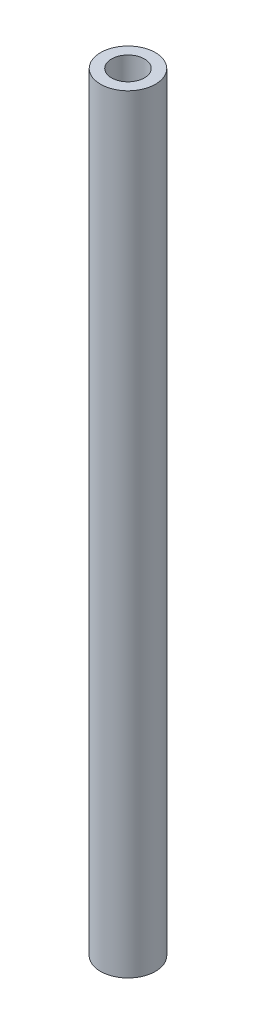
ISO-10303-21;
HEADER;
FILE_DESCRIPTION(('STEP AP214'),'2;1');
FILE_NAME('part.step','',(''),(''),'','','');
FILE_SCHEMA(('AUTOMOTIVE_DESIGN { 1 0 10303 214 1 1 1 1 }'));
ENDSEC;
DATA;
#1=APPLICATION_CONTEXT('core data for automotive mechanical design processes');
#2=APPLICATION_PROTOCOL_DEFINITION('international standard','automotive_design',2000,#1);
#3=PRODUCT_CONTEXT('',#1,'mechanical');
#4=PRODUCT('Part','Part','',(#3));
#5=PRODUCT_RELATED_PRODUCT_CATEGORY('part','',(#4));
#6=PRODUCT_DEFINITION_FORMATION('','',#4);
#7=PRODUCT_DEFINITION_CONTEXT('part definition',#1,'design');
#8=PRODUCT_DEFINITION('design','',#6,#7);
#9=PRODUCT_DEFINITION_SHAPE('','',#8);
#10=(LENGTH_UNIT() NAMED_UNIT(*) SI_UNIT(.MILLI.,.METRE.));
#11=(NAMED_UNIT(*) PLANE_ANGLE_UNIT() SI_UNIT($,.RADIAN.));
#12=(NAMED_UNIT(*) SI_UNIT($,.STERADIAN.) SOLID_ANGLE_UNIT());
#13=UNCERTAINTY_MEASURE_WITH_UNIT(LENGTH_MEASURE(1.E-05),#10,'distance_accuracy_value','');
#14=(GEOMETRIC_REPRESENTATION_CONTEXT(3) GLOBAL_UNCERTAINTY_ASSIGNED_CONTEXT((#13)) GLOBAL_UNIT_ASSIGNED_CONTEXT((#10,
#11,#12)) REPRESENTATION_CONTEXT('',''));
#15=CARTESIAN_POINT('',(0.,0.,0.));
#16=DIRECTION('',(0.,0.,1.));
#17=DIRECTION('',(1.,0.,0.));
#18=AXIS2_PLACEMENT_3D('',#15,#16,#17);
#19=CARTESIAN_POINT('',(0.,70.,0.));
#20=DIRECTION('',(0.,1.,0.));
#21=DIRECTION('',(0.,0.,1.));
#22=AXIS2_PLACEMENT_3D('',#19,#20,#21);
#23=PLANE('',#22);
#24=CARTESIAN_POINT('',(0.,70.,0.));
#25=DIRECTION('',(0.,1.,0.));
#26=DIRECTION('',(0.,0.,1.));
#27=AXIS2_PLACEMENT_3D('',#24,#25,#26);
#28=CIRCLE('',#27,2.5);
#29=CARTESIAN_POINT('',(0.,70.,2.5));
#30=VERTEX_POINT('',#29);
#31=EDGE_CURVE('E10',#30,#30,#28,.T.);
#32=ORIENTED_EDGE('',*,*,#31,.T.);
#33=EDGE_LOOP('',(#32));
#34=FACE_BOUND('',#33,.T.);
#35=CARTESIAN_POINT('',(0.,70.,0.));
#36=DIRECTION('',(0.,1.,0.));
#37=DIRECTION('',(0.,0.,1.));
#38=AXIS2_PLACEMENT_3D('',#35,#36,#37);
#39=CIRCLE('',#38,1.5);
#40=CARTESIAN_POINT('',(0.,70.,1.5));
#41=VERTEX_POINT('',#40);
#42=EDGE_CURVE('E54',#41,#41,#39,.T.);
#43=ORIENTED_EDGE('',*,*,#42,.F.);
#44=EDGE_LOOP('',(#43));
#45=FACE_BOUND('',#44,.T.);
#46=ADVANCED_FACE('F41',(#34,#45),#23,.T.);
#47=CARTESIAN_POINT('',(0.,0.,0.));
#48=DIRECTION('',(0.,1.,0.));
#49=DIRECTION('',(0.,0.,1.));
#50=AXIS2_PLACEMENT_3D('',#47,#48,#49);
#51=PLANE('',#50);
#52=CARTESIAN_POINT('',(0.,0.,0.));
#53=DIRECTION('',(0.,1.,0.));
#54=DIRECTION('',(0.,0.,1.));
#55=AXIS2_PLACEMENT_3D('',#52,#53,#54);
#56=CIRCLE('',#55,2.5);
#57=CARTESIAN_POINT('',(0.,0.,2.5));
#58=VERTEX_POINT('',#57);
#59=EDGE_CURVE('E45',#58,#58,#56,.T.);
#60=ORIENTED_EDGE('',*,*,#59,.F.);
#61=EDGE_LOOP('',(#60));
#62=FACE_BOUND('',#61,.T.);
#63=CARTESIAN_POINT('',(0.,0.,0.));
#64=DIRECTION('',(0.,1.,0.));
#65=DIRECTION('',(0.,0.,1.));
#66=AXIS2_PLACEMENT_3D('',#63,#64,#65);
#67=CIRCLE('',#66,1.5);
#68=CARTESIAN_POINT('',(0.,0.,1.5));
#69=VERTEX_POINT('',#68);
#70=EDGE_CURVE('E56',#69,#69,#67,.T.);
#71=ORIENTED_EDGE('',*,*,#70,.T.);
#72=EDGE_LOOP('',(#71));
#73=FACE_BOUND('',#72,.T.);
#74=ADVANCED_FACE('F68',(#62,#73),#51,.F.);
#75=CARTESIAN_POINT('',(0.,70.,0.));
#76=DIRECTION('',(0.,-1.,0.));
#77=DIRECTION('',(0.,0.,-1.));
#78=AXIS2_PLACEMENT_3D('',#75,#76,#77);
#79=CYLINDRICAL_SURFACE('',#78,2.5);
#80=ORIENTED_EDGE('',*,*,#31,.F.);
#81=EDGE_LOOP('',(#80));
#82=FACE_BOUND('',#81,.T.);
#83=ORIENTED_EDGE('',*,*,#59,.T.);
#84=EDGE_LOOP('',(#83));
#85=FACE_BOUND('',#84,.T.);
#86=ADVANCED_FACE('F43',(#82,#85),#79,.T.);
#87=CARTESIAN_POINT('',(0.,70.,0.));
#88=DIRECTION('',(0.,-1.,0.));
#89=DIRECTION('',(0.,0.,-1.));
#90=AXIS2_PLACEMENT_3D('',#87,#88,#89);
#91=CYLINDRICAL_SURFACE('',#90,1.5);
#92=ORIENTED_EDGE('',*,*,#42,.T.);
#93=EDGE_LOOP('',(#92));
#94=FACE_BOUND('',#93,.T.);
#95=ORIENTED_EDGE('',*,*,#70,.F.);
#96=EDGE_LOOP('',(#95));
#97=FACE_BOUND('',#96,.T.);
#98=ADVANCED_FACE('F64',(#94,#97),#91,.F.);
#99=CLOSED_SHELL('',(#46,#74,#86,#98));
#100=MANIFOLD_SOLID_BREP('B2',#99);
#101=ADVANCED_BREP_SHAPE_REPRESENTATION('',(#18,#100),#14);
#102=SHAPE_DEFINITION_REPRESENTATION(#9,#101);
ENDSEC;
END-ISO-10303-21;
